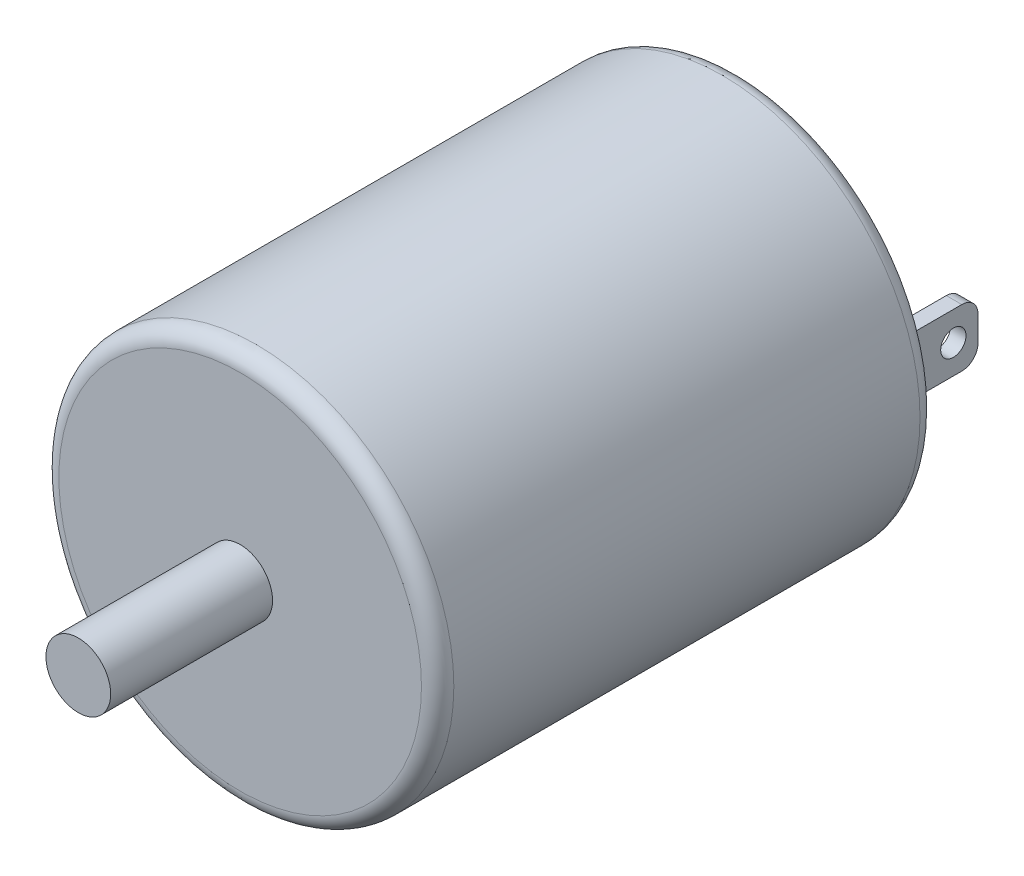
ISO-10303-21;
HEADER;
FILE_DESCRIPTION(('STEP AP214'),'2;1');
FILE_NAME('part.step','',(''),(''),'','','');
FILE_SCHEMA(('AUTOMOTIVE_DESIGN { 1 0 10303 214 1 1 1 1 }'));
ENDSEC;
DATA;
#1=APPLICATION_CONTEXT('core data for automotive mechanical design processes');
#2=APPLICATION_PROTOCOL_DEFINITION('international standard','automotive_design',2000,#1);
#3=PRODUCT_CONTEXT('',#1,'mechanical');
#4=PRODUCT('Part','Part','',(#3));
#5=PRODUCT_RELATED_PRODUCT_CATEGORY('part','',(#4));
#6=PRODUCT_DEFINITION_FORMATION('','',#4);
#7=PRODUCT_DEFINITION_CONTEXT('part definition',#1,'design');
#8=PRODUCT_DEFINITION('design','',#6,#7);
#9=PRODUCT_DEFINITION_SHAPE('','',#8);
#10=(LENGTH_UNIT() NAMED_UNIT(*) SI_UNIT(.MILLI.,.METRE.));
#11=(NAMED_UNIT(*) PLANE_ANGLE_UNIT() SI_UNIT($,.RADIAN.));
#12=(NAMED_UNIT(*) SI_UNIT($,.STERADIAN.) SOLID_ANGLE_UNIT());
#13=UNCERTAINTY_MEASURE_WITH_UNIT(LENGTH_MEASURE(1.E-05),#10,'distance_accuracy_value','');
#14=(GEOMETRIC_REPRESENTATION_CONTEXT(3) GLOBAL_UNCERTAINTY_ASSIGNED_CONTEXT((#13)) GLOBAL_UNIT_ASSIGNED_CONTEXT((#10,
#11,#12)) REPRESENTATION_CONTEXT('',''));
#15=CARTESIAN_POINT('',(0.,0.,0.));
#16=DIRECTION('',(0.,0.,1.));
#17=DIRECTION('',(1.,0.,0.));
#18=AXIS2_PLACEMENT_3D('',#15,#16,#17);
#19=CARTESIAN_POINT('',(0.,0.,0.));
#20=DIRECTION('',(0.,0.,1.));
#21=DIRECTION('',(1.,0.,0.));
#22=AXIS2_PLACEMENT_3D('',#19,#20,#21);
#23=PLANE('',#22);
#24=DIRECTION('',(0.,-1.,0.));
#25=VECTOR('',#24,1.);
#26=CARTESIAN_POINT('',(9.78281553796734,2.33021416497081,0.));
#27=LINE('',#26,#25);
#28=CARTESIAN_POINT('',(9.78281553796734,2.33021416497081,0.));
#29=VERTEX_POINT('',#28);
#30=CARTESIAN_POINT('',(9.78281553796734,-1.23400517051664,0.));
#31=VERTEX_POINT('',#30);
#32=EDGE_CURVE('E163',#29,#31,#27,.T.);
#33=ORIENTED_EDGE('',*,*,#32,.F.);
#34=DIRECTION('',(1.,0.,0.));
#35=VECTOR('',#34,1.);
#36=CARTESIAN_POINT('',(9.78281553796734,2.33021416497081,0.));
#37=LINE('',#36,#35);
#38=CARTESIAN_POINT('',(8.82391201155741,2.33021416497081,0.));
#39=VERTEX_POINT('',#38);
#40=EDGE_CURVE('E168',#39,#29,#37,.T.);
#41=ORIENTED_EDGE('',*,*,#40,.F.);
#42=DIRECTION('',(0.,1.,0.));
#43=VECTOR('',#42,1.);
#44=CARTESIAN_POINT('',(8.82391201155741,2.33021416497081,0.));
#45=LINE('',#44,#43);
#46=CARTESIAN_POINT('',(8.82391201155741,-1.23400517051664,0.));
#47=VERTEX_POINT('',#46);
#48=EDGE_CURVE('E177',#47,#39,#45,.T.);
#49=ORIENTED_EDGE('',*,*,#48,.F.);
#50=DIRECTION('',(-1.,0.,0.));
#51=VECTOR('',#50,1.);
#52=CARTESIAN_POINT('',(9.78281553796734,-1.23400517051664,0.));
#53=LINE('',#52,#51);
#54=EDGE_CURVE('E174',#31,#47,#53,.T.);
#55=ORIENTED_EDGE('',*,*,#54,.F.);
#56=EDGE_LOOP('',(#33,#41,#49,#55));
#57=FACE_BOUND('',#56,.T.);
#58=CARTESIAN_POINT('',(0.,0.,0.));
#59=DIRECTION('',(0.,0.,1.));
#60=DIRECTION('',(1.,0.,0.));
#61=AXIS2_PLACEMENT_3D('',#58,#59,#60);
#62=CIRCLE('',#61,11.2);
#63=CARTESIAN_POINT('',(11.2,0.,0.));
#64=VERTEX_POINT('',#63);
#65=EDGE_CURVE('E201',#64,#64,#62,.F.);
#66=ORIENTED_EDGE('',*,*,#65,.T.);
#67=EDGE_LOOP('',(#66));
#68=FACE_BOUND('',#67,.T.);
#69=DIRECTION('',(0.,1.,0.));
#70=VECTOR('',#69,1.);
#71=CARTESIAN_POINT('',(-8.81697969084172,2.33021416497081,0.));
#72=LINE('',#71,#70);
#73=CARTESIAN_POINT('',(-8.81697969084172,-1.23400517051664,0.));
#74=VERTEX_POINT('',#73);
#75=CARTESIAN_POINT('',(-8.81697969084172,2.33021416497081,0.));
#76=VERTEX_POINT('',#75);
#77=EDGE_CURVE('E129',#74,#76,#72,.T.);
#78=ORIENTED_EDGE('',*,*,#77,.F.);
#79=DIRECTION('',(-1.,0.,0.));
#80=VECTOR('',#79,1.);
#81=CARTESIAN_POINT('',(-8.81697969084172,-1.23400517051664,0.));
#82=LINE('',#81,#80);
#83=CARTESIAN_POINT('',(-7.92257314699185,-1.23400517051664,0.));
#84=VERTEX_POINT('',#83);
#85=EDGE_CURVE('E142',#84,#74,#82,.T.);
#86=ORIENTED_EDGE('',*,*,#85,.F.);
#87=DIRECTION('',(0.,-1.,0.));
#88=VECTOR('',#87,1.);
#89=CARTESIAN_POINT('',(-7.92257314699185,2.33021416497081,0.));
#90=LINE('',#89,#88);
#91=CARTESIAN_POINT('',(-7.92257314699185,2.33021416497081,0.));
#92=VERTEX_POINT('',#91);
#93=EDGE_CURVE('E151',#92,#84,#90,.T.);
#94=ORIENTED_EDGE('',*,*,#93,.F.);
#95=DIRECTION('',(1.,0.,0.));
#96=VECTOR('',#95,1.);
#97=CARTESIAN_POINT('',(-8.81697969084172,2.33021416497081,0.));
#98=LINE('',#97,#96);
#99=EDGE_CURVE('E145',#76,#92,#98,.T.);
#100=ORIENTED_EDGE('',*,*,#99,.F.);
#101=EDGE_LOOP('',(#78,#86,#94,#100));
#102=FACE_BOUND('',#101,.T.);
#103=ADVANCED_FACE('F35',(#57,#68,#102),#23,.F.);
#104=CARTESIAN_POINT('',(0.,0.,30.8));
#105=DIRECTION('',(0.,0.,1.));
#106=DIRECTION('',(1.,0.,0.));
#107=AXIS2_PLACEMENT_3D('',#104,#105,#106);
#108=PLANE('',#107);
#109=CARTESIAN_POINT('',(0.,0.,30.8));
#110=DIRECTION('',(0.,0.,1.));
#111=DIRECTION('',(1.,0.,0.));
#112=AXIS2_PLACEMENT_3D('',#109,#110,#111);
#113=CIRCLE('',#112,11.2);
#114=CARTESIAN_POINT('',(11.2,0.,30.8));
#115=VERTEX_POINT('',#114);
#116=EDGE_CURVE('E204',#115,#115,#113,.T.);
#117=ORIENTED_EDGE('',*,*,#116,.T.);
#118=EDGE_LOOP('',(#117));
#119=FACE_BOUND('',#118,.T.);
#120=CARTESIAN_POINT('',(0.,0.,30.8));
#121=DIRECTION('',(0.,0.,1.));
#122=DIRECTION('',(1.,0.,0.));
#123=AXIS2_PLACEMENT_3D('',#120,#121,#122);
#124=CIRCLE('',#123,2.);
#125=CARTESIAN_POINT('',(2.,0.,30.8));
#126=VERTEX_POINT('',#125);
#127=EDGE_CURVE('E189',#126,#126,#124,.T.);
#128=ORIENTED_EDGE('',*,*,#127,.F.);
#129=EDGE_LOOP('',(#128));
#130=FACE_BOUND('',#129,.T.);
#131=ADVANCED_FACE('F271',(#119,#130),#108,.T.);
#132=CARTESIAN_POINT('',(0.,0.,30.8));
#133=DIRECTION('',(0.,0.,-1.));
#134=DIRECTION('',(-1.,0.,0.));
#135=AXIS2_PLACEMENT_3D('',#132,#133,#134);
#136=CYLINDRICAL_SURFACE('',#135,12.2);
#137=CARTESIAN_POINT('',(0.,0.,1.));
#138=DIRECTION('',(0.,0.,1.));
#139=DIRECTION('',(1.,0.,0.));
#140=AXIS2_PLACEMENT_3D('',#137,#138,#139);
#141=CIRCLE('',#140,12.2);
#142=CARTESIAN_POINT('',(-12.2,0.,0.999999999999997));
#143=VERTEX_POINT('',#142);
#144=EDGE_CURVE('E198',#143,#143,#141,.T.);
#145=CARTESIAN_POINT('',(0.,0.,29.8));
#146=DIRECTION('',(0.,0.,1.));
#147=DIRECTION('',(1.,0.,0.));
#148=AXIS2_PLACEMENT_3D('',#145,#146,#147);
#149=CIRCLE('',#148,12.2);
#150=CARTESIAN_POINT('',(-12.2,0.,29.8));
#151=VERTEX_POINT('',#150);
#152=EDGE_CURVE('E193',#151,#151,#149,.F.);
#153=CARTESIAN_POINT('',(-12.2,0.,0.999999999999997));
#154=CARTESIAN_POINT('',(-12.2,0.,1.3));
#155=CARTESIAN_POINT('',(-12.2,0.,1.6));
#156=CARTESIAN_POINT('',(-12.2,0.,2.2));
#157=CARTESIAN_POINT('',(-12.2,0.,2.5));
#158=CARTESIAN_POINT('',(-12.2,0.,3.1));
#159=CARTESIAN_POINT('',(-12.2,0.,3.4));
#160=CARTESIAN_POINT('',(-12.2,0.,4.));
#161=CARTESIAN_POINT('',(-12.2,0.,4.3));
#162=CARTESIAN_POINT('',(-12.2,0.,4.9));
#163=CARTESIAN_POINT('',(-12.2,0.,5.2));
#164=CARTESIAN_POINT('',(-12.2,0.,5.8));
#165=CARTESIAN_POINT('',(-12.2,0.,6.1));
#166=CARTESIAN_POINT('',(-12.2,0.,6.7));
#167=CARTESIAN_POINT('',(-12.2,0.,7.));
#168=CARTESIAN_POINT('',(-12.2,0.,7.6));
#169=CARTESIAN_POINT('',(-12.2,0.,7.9));
#170=CARTESIAN_POINT('',(-12.2,0.,8.5));
#171=CARTESIAN_POINT('',(-12.2,0.,8.8));
#172=CARTESIAN_POINT('',(-12.2,0.,9.4));
#173=CARTESIAN_POINT('',(-12.2,0.,9.7));
#174=CARTESIAN_POINT('',(-12.2,0.,10.3));
#175=CARTESIAN_POINT('',(-12.2,0.,10.6));
#176=CARTESIAN_POINT('',(-12.2,0.,11.2));
#177=CARTESIAN_POINT('',(-12.2,0.,11.5));
#178=CARTESIAN_POINT('',(-12.2,0.,12.1));
#179=CARTESIAN_POINT('',(-12.2,0.,12.4));
#180=CARTESIAN_POINT('',(-12.2,0.,13.));
#181=CARTESIAN_POINT('',(-12.2,0.,13.3));
#182=CARTESIAN_POINT('',(-12.2,0.,13.9));
#183=CARTESIAN_POINT('',(-12.2,0.,14.2));
#184=CARTESIAN_POINT('',(-12.2,0.,14.8));
#185=CARTESIAN_POINT('',(-12.2,0.,15.1));
#186=CARTESIAN_POINT('',(-12.2,0.,15.7));
#187=CARTESIAN_POINT('',(-12.2,0.,16.));
#188=CARTESIAN_POINT('',(-12.2,0.,16.6));
#189=CARTESIAN_POINT('',(-12.2,0.,16.9));
#190=CARTESIAN_POINT('',(-12.2,0.,17.5));
#191=CARTESIAN_POINT('',(-12.2,0.,17.8));
#192=CARTESIAN_POINT('',(-12.2,0.,18.4));
#193=CARTESIAN_POINT('',(-12.2,0.,18.7));
#194=CARTESIAN_POINT('',(-12.2,0.,19.3));
#195=CARTESIAN_POINT('',(-12.2,0.,19.6));
#196=CARTESIAN_POINT('',(-12.2,0.,20.2));
#197=CARTESIAN_POINT('',(-12.2,0.,20.5));
#198=CARTESIAN_POINT('',(-12.2,0.,21.1));
#199=CARTESIAN_POINT('',(-12.2,0.,21.4));
#200=CARTESIAN_POINT('',(-12.2,0.,22.));
#201=CARTESIAN_POINT('',(-12.2,0.,22.3));
#202=CARTESIAN_POINT('',(-12.2,0.,22.9));
#203=CARTESIAN_POINT('',(-12.2,0.,23.2));
#204=CARTESIAN_POINT('',(-12.2,0.,23.8));
#205=CARTESIAN_POINT('',(-12.2,0.,24.1));
#206=CARTESIAN_POINT('',(-12.2,0.,24.7));
#207=CARTESIAN_POINT('',(-12.2,0.,25.));
#208=CARTESIAN_POINT('',(-12.2,0.,25.6));
#209=CARTESIAN_POINT('',(-12.2,0.,25.9));
#210=CARTESIAN_POINT('',(-12.2,0.,26.5));
#211=CARTESIAN_POINT('',(-12.2,0.,26.8));
#212=CARTESIAN_POINT('',(-12.2,0.,27.4));
#213=CARTESIAN_POINT('',(-12.2,0.,27.7));
#214=CARTESIAN_POINT('',(-12.2,0.,28.3));
#215=CARTESIAN_POINT('',(-12.2,0.,28.6));
#216=CARTESIAN_POINT('',(-12.2,0.,29.2));
#217=CARTESIAN_POINT('',(-12.2,0.,29.5));
#218=CARTESIAN_POINT('',(-12.2,0.,29.8));
#219=B_SPLINE_CURVE_WITH_KNOTS('',3,(#153,#154,#155,#156,#157,#158,#159,#160,#161,#162,#163,
#164,#165,#166,#167,#168,#169,#170,#171,#172,#173,#174,#175,#176,#177,#178,#179,#180,#181,#182,
#183,#184,#185,#186,#187,#188,#189,#190,#191,#192,#193,#194,#195,#196,#197,#198,#199,#200,#201,
#202,#203,#204,#205,#206,#207,#208,#209,#210,#211,#212,#213,#214,#215,#216,#217,#218),
.UNSPECIFIED.,.F.,.F.,(4,2,2,2,2,2,2,2,2,2,2,2,2,2,2,2,2,2,2,2,2,2,2,2,2,2,2,2,2,2,2,2,4),(0.,
0.900000000000001,1.8,2.7,3.6,4.5,5.4,6.3,7.2,8.1,9.,9.9,10.8,11.7,12.6,13.5,14.4,15.3,16.2,
17.1,18.,18.9,19.8,20.7,21.6,22.5,23.4,24.3,25.2,26.1,27.,27.9,28.8),.UNSPECIFIED.);
#220=EDGE_CURVE('BSEAM276',#143,#151,#219,.T.);
#221=ORIENTED_EDGE('',*,*,#144,.T.);
#222=ORIENTED_EDGE('',*,*,#152,.T.);
#223=ORIENTED_EDGE('',*,*,#220,.T.);
#224=ORIENTED_EDGE('',*,*,#220,.F.);
#225=EDGE_LOOP('',(#221,#223,#222,#224));
#226=FACE_BOUND('',#225,.T.);
#227=ADVANCED_FACE('F276',(#226),#136,.T.);
#228=CARTESIAN_POINT('',(0.,0.,1.));
#229=DIRECTION('',(0.,0.,1.));
#230=DIRECTION('',(1.,0.,0.));
#231=AXIS2_PLACEMENT_3D('',#228,#229,#230);
#232=TOROIDAL_SURFACE('',#231,11.2,1.);
#233=ORIENTED_EDGE('',*,*,#65,.F.);
#234=EDGE_LOOP('',(#233));
#235=FACE_BOUND('',#234,.T.);
#236=ORIENTED_EDGE('',*,*,#144,.F.);
#237=EDGE_LOOP('',(#236));
#238=FACE_BOUND('',#237,.T.);
#239=ADVANCED_FACE('F283',(#235,#238),#232,.T.);
#240=CARTESIAN_POINT('',(0.,0.,29.8));
#241=DIRECTION('',(0.,0.,1.));
#242=DIRECTION('',(1.,0.,0.));
#243=AXIS2_PLACEMENT_3D('',#240,#241,#242);
#244=TOROIDAL_SURFACE('',#243,11.2,1.);
#245=ORIENTED_EDGE('',*,*,#152,.F.);
#246=EDGE_LOOP('',(#245));
#247=FACE_BOUND('',#246,.T.);
#248=ORIENTED_EDGE('',*,*,#116,.F.);
#249=EDGE_LOOP('',(#248));
#250=FACE_BOUND('',#249,.T.);
#251=ADVANCED_FACE('F287',(#247,#250),#244,.T.);
#252=CARTESIAN_POINT('',(0.,0.,40.8));
#253=DIRECTION('',(0.,0.,-1.));
#254=DIRECTION('',(-1.,0.,0.));
#255=AXIS2_PLACEMENT_3D('',#252,#253,#254);
#256=CYLINDRICAL_SURFACE('',#255,2.);
#257=CARTESIAN_POINT('',(0.,0.,40.8));
#258=DIRECTION('',(0.,0.,1.));
#259=DIRECTION('',(1.,0.,0.));
#260=AXIS2_PLACEMENT_3D('',#257,#258,#259);
#261=CIRCLE('',#260,2.);
#262=CARTESIAN_POINT('',(2.,0.,40.8));
#263=VERTEX_POINT('',#262);
#264=EDGE_CURVE('E190',#263,#263,#261,.T.);
#265=ORIENTED_EDGE('',*,*,#264,.F.);
#266=EDGE_LOOP('',(#265));
#267=FACE_BOUND('',#266,.T.);
#268=ORIENTED_EDGE('',*,*,#127,.T.);
#269=EDGE_LOOP('',(#268));
#270=FACE_BOUND('',#269,.T.);
#271=ADVANCED_FACE('F291',(#267,#270),#256,.T.);
#272=CARTESIAN_POINT('',(0.,0.,40.8));
#273=DIRECTION('',(0.,0.,1.));
#274=DIRECTION('',(1.,0.,0.));
#275=AXIS2_PLACEMENT_3D('',#272,#273,#274);
#276=PLANE('',#275);
#277=ORIENTED_EDGE('',*,*,#264,.T.);
#278=EDGE_LOOP('',(#277));
#279=FACE_BOUND('',#278,.T.);
#280=ADVANCED_FACE('F340',(#279),#276,.T.);
#281=CARTESIAN_POINT('',(9.78281553796734,2.33021416497081,-5.));
#282=DIRECTION('',(-1.,0.,0.));
#283=DIRECTION('',(0.,0.,1.));
#284=AXIS2_PLACEMENT_3D('',#281,#282,#283);
#285=PLANE('',#284);
#286=CARTESIAN_POINT('',(9.78281553796734,0.548104497227087,-3.47716986038904));
#287=DIRECTION('',(1.,0.,0.));
#288=DIRECTION('',(0.,0.,-1.));
#289=AXIS2_PLACEMENT_3D('',#286,#287,#288);
#290=CIRCLE('',#289,0.782109667743725);
#291=CARTESIAN_POINT('',(9.78281553796734,0.548104497227087,-4.25927952813276));
#292=VERTEX_POINT('',#291);
#293=EDGE_CURVE('E449',#292,#292,#290,.T.);
#294=ORIENTED_EDGE('',*,*,#293,.F.);
#295=EDGE_LOOP('',(#294));
#296=FACE_BOUND('',#295,.T.);
#297=DIRECTION('',(0.,-1.,0.));
#298=VECTOR('',#297,1.);
#299=CARTESIAN_POINT('',(9.78281553796734,2.33021416497081,-5.));
#300=LINE('',#299,#298);
#301=CARTESIAN_POINT('',(9.78281553796734,1.33021416497081,-5.));
#302=VERTEX_POINT('',#301);
#303=CARTESIAN_POINT('',(9.78281553796734,-0.234005170516639,-5.));
#304=VERTEX_POINT('',#303);
#305=EDGE_CURVE('E164',#302,#304,#300,.T.);
#306=ORIENTED_EDGE('',*,*,#305,.F.);
#307=CARTESIAN_POINT('',(9.78281553796734,1.33021416497081,-4.));
#308=DIRECTION('',(-1.,0.,0.));
#309=DIRECTION('',(0.,0.,1.));
#310=AXIS2_PLACEMENT_3D('',#307,#308,#309);
#311=CIRCLE('',#310,1.);
#312=CARTESIAN_POINT('',(9.78281553796734,2.33021416497081,-4.));
#313=VERTEX_POINT('',#312);
#314=EDGE_CURVE('E232',#302,#313,#311,.F.);
#315=ORIENTED_EDGE('',*,*,#314,.T.);
#316=DIRECTION('',(0.,0.,1.));
#317=VECTOR('',#316,1.);
#318=CARTESIAN_POINT('',(9.78281553796734,2.33021416497081,-5.));
#319=LINE('',#318,#317);
#320=EDGE_CURVE('E171',#313,#29,#319,.T.);
#321=ORIENTED_EDGE('',*,*,#320,.T.);
#322=ORIENTED_EDGE('',*,*,#32,.T.);
#323=DIRECTION('',(0.,0.,1.));
#324=VECTOR('',#323,1.);
#325=CARTESIAN_POINT('',(9.78281553796734,-1.23400517051664,-5.));
#326=LINE('',#325,#324);
#327=CARTESIAN_POINT('',(9.78281553796734,-1.23400517051664,-4.));
#328=VERTEX_POINT('',#327);
#329=EDGE_CURVE('E187',#328,#31,#326,.T.);
#330=ORIENTED_EDGE('',*,*,#329,.F.);
#331=CARTESIAN_POINT('',(9.78281553796734,-0.234005170516639,-4.));
#332=DIRECTION('',(-1.,0.,0.));
#333=DIRECTION('',(0.,0.,1.));
#334=AXIS2_PLACEMENT_3D('',#331,#332,#333);
#335=CIRCLE('',#334,1.);
#336=EDGE_CURVE('E230',#328,#304,#335,.F.);
#337=ORIENTED_EDGE('',*,*,#336,.T.);
#338=EDGE_LOOP('',(#306,#315,#321,#322,#330,#337));
#339=FACE_BOUND('',#338,.T.);
#340=ADVANCED_FACE('F246',(#296,#339),#285,.F.);
#341=CARTESIAN_POINT('',(9.78281553796734,-1.23400517051664,-5.));
#342=DIRECTION('',(0.,1.,0.));
#343=DIRECTION('',(0.,0.,1.));
#344=AXIS2_PLACEMENT_3D('',#341,#342,#343);
#345=PLANE('',#344);
#346=DIRECTION('',(0.,0.,1.));
#347=VECTOR('',#346,1.);
#348=CARTESIAN_POINT('',(8.82391201155741,-1.23400517051664,-5.));
#349=LINE('',#348,#347);
#350=CARTESIAN_POINT('',(8.82391201155741,-1.23400517051664,-4.));
#351=VERTEX_POINT('',#350);
#352=EDGE_CURVE('E185',#351,#47,#349,.T.);
#353=ORIENTED_EDGE('',*,*,#352,.F.);
#354=DIRECTION('',(-1.,0.,0.));
#355=VECTOR('',#354,1.);
#356=CARTESIAN_POINT('',(9.78281553796734,-1.23400517051664,-4.));
#357=LINE('',#356,#355);
#358=EDGE_CURVE('E11',#351,#328,#357,.F.);
#359=ORIENTED_EDGE('',*,*,#358,.T.);
#360=ORIENTED_EDGE('',*,*,#329,.T.);
#361=ORIENTED_EDGE('',*,*,#54,.T.);
#362=EDGE_LOOP('',(#353,#359,#360,#361));
#363=FACE_BOUND('',#362,.T.);
#364=ADVANCED_FACE('F256',(#363),#345,.F.);
#365=CARTESIAN_POINT('',(8.82391201155741,2.33021416497081,-5.));
#366=DIRECTION('',(1.,0.,0.));
#367=DIRECTION('',(0.,0.,-1.));
#368=AXIS2_PLACEMENT_3D('',#365,#366,#367);
#369=PLANE('',#368);
#370=CARTESIAN_POINT('',(8.82391201155741,0.548104497227087,-3.47716986038904));
#371=DIRECTION('',(1.,0.,0.));
#372=DIRECTION('',(0.,0.,-1.));
#373=AXIS2_PLACEMENT_3D('',#370,#371,#372);
#374=CIRCLE('',#373,0.782109667743725);
#375=CARTESIAN_POINT('',(8.82391201155741,0.548104497227087,-4.25927952813276));
#376=VERTEX_POINT('',#375);
#377=EDGE_CURVE('E146',#376,#376,#374,.T.);
#378=ORIENTED_EDGE('',*,*,#377,.T.);
#379=EDGE_LOOP('',(#378));
#380=FACE_BOUND('',#379,.T.);
#381=DIRECTION('',(0.,0.,1.));
#382=VECTOR('',#381,1.);
#383=CARTESIAN_POINT('',(8.82391201155741,2.33021416497081,-5.));
#384=LINE('',#383,#382);
#385=CARTESIAN_POINT('',(8.82391201155741,2.33021416497081,-4.));
#386=VERTEX_POINT('',#385);
#387=EDGE_CURVE('E183',#386,#39,#384,.T.);
#388=ORIENTED_EDGE('',*,*,#387,.F.);
#389=CARTESIAN_POINT('',(8.82391201155741,1.33021416497081,-4.));
#390=DIRECTION('',(1.,0.,0.));
#391=DIRECTION('',(0.,0.,-1.));
#392=AXIS2_PLACEMENT_3D('',#389,#390,#391);
#393=CIRCLE('',#392,1.);
#394=CARTESIAN_POINT('',(8.82391201155741,1.33021416497081,-5.));
#395=VERTEX_POINT('',#394);
#396=EDGE_CURVE('E44',#386,#395,#393,.F.);
#397=ORIENTED_EDGE('',*,*,#396,.T.);
#398=DIRECTION('',(0.,1.,0.));
#399=VECTOR('',#398,1.);
#400=CARTESIAN_POINT('',(8.82391201155741,2.33021416497081,-5.));
#401=LINE('',#400,#399);
#402=CARTESIAN_POINT('',(8.82391201155741,-0.234005170516639,-5.));
#403=VERTEX_POINT('',#402);
#404=EDGE_CURVE('E167',#403,#395,#401,.T.);
#405=ORIENTED_EDGE('',*,*,#404,.F.);
#406=CARTESIAN_POINT('',(8.82391201155741,-0.234005170516639,-4.));
#407=DIRECTION('',(1.,0.,0.));
#408=DIRECTION('',(0.,0.,-1.));
#409=AXIS2_PLACEMENT_3D('',#406,#407,#408);
#410=CIRCLE('',#409,1.);
#411=EDGE_CURVE('E51',#403,#351,#410,.F.);
#412=ORIENTED_EDGE('',*,*,#411,.T.);
#413=ORIENTED_EDGE('',*,*,#352,.T.);
#414=ORIENTED_EDGE('',*,*,#48,.T.);
#415=EDGE_LOOP('',(#388,#397,#405,#412,#413,#414));
#416=FACE_BOUND('',#415,.T.);
#417=ADVANCED_FACE('F237',(#380,#416),#369,.F.);
#418=CARTESIAN_POINT('',(9.78281553796734,2.33021416497081,-5.));
#419=DIRECTION('',(0.,-1.,0.));
#420=DIRECTION('',(0.,0.,-1.));
#421=AXIS2_PLACEMENT_3D('',#418,#419,#420);
#422=PLANE('',#421);
#423=ORIENTED_EDGE('',*,*,#320,.F.);
#424=DIRECTION('',(1.,0.,0.));
#425=VECTOR('',#424,1.);
#426=CARTESIAN_POINT('',(8.82391201155741,2.33021416497081,-4.));
#427=LINE('',#426,#425);
#428=EDGE_CURVE('E59',#313,#386,#427,.F.);
#429=ORIENTED_EDGE('',*,*,#428,.T.);
#430=ORIENTED_EDGE('',*,*,#387,.T.);
#431=ORIENTED_EDGE('',*,*,#40,.T.);
#432=EDGE_LOOP('',(#423,#429,#430,#431));
#433=FACE_BOUND('',#432,.T.);
#434=ADVANCED_FACE('F248',(#433),#422,.F.);
#435=CARTESIAN_POINT('',(9.78281553796734,-1.23400517051664,-5.));
#436=DIRECTION('',(0.,0.,-1.));
#437=DIRECTION('',(-1.,0.,0.));
#438=AXIS2_PLACEMENT_3D('',#435,#436,#437);
#439=PLANE('',#438);
#440=ORIENTED_EDGE('',*,*,#404,.T.);
#441=DIRECTION('',(1.,0.,0.));
#442=VECTOR('',#441,1.);
#443=CARTESIAN_POINT('',(9.78281553796734,1.33021416497081,-5.));
#444=LINE('',#443,#442);
#445=EDGE_CURVE('E227',#395,#302,#444,.T.);
#446=ORIENTED_EDGE('',*,*,#445,.T.);
#447=ORIENTED_EDGE('',*,*,#305,.T.);
#448=DIRECTION('',(-1.,0.,0.));
#449=VECTOR('',#448,1.);
#450=CARTESIAN_POINT('',(8.82391201155741,-0.234005170516639,-5.));
#451=LINE('',#450,#449);
#452=EDGE_CURVE('E224',#304,#403,#451,.T.);
#453=ORIENTED_EDGE('',*,*,#452,.T.);
#454=EDGE_LOOP('',(#440,#446,#447,#453));
#455=FACE_BOUND('',#454,.T.);
#456=ADVANCED_FACE('F241',(#455),#439,.T.);
#457=CARTESIAN_POINT('',(-8.81697969084172,2.33021416497081,-5.));
#458=DIRECTION('',(1.,0.,0.));
#459=DIRECTION('',(0.,0.,-1.));
#460=AXIS2_PLACEMENT_3D('',#457,#458,#459);
#461=PLANE('',#460);
#462=CARTESIAN_POINT('',(-8.81697969084172,0.548104497227087,-3.47716986038904));
#463=DIRECTION('',(1.,0.,0.));
#464=DIRECTION('',(0.,0.,-1.));
#465=AXIS2_PLACEMENT_3D('',#462,#463,#464);
#466=CIRCLE('',#465,0.782109667743725);
#467=CARTESIAN_POINT('',(-8.81697969084172,0.548104497227087,-4.25927952813276));
#468=VERTEX_POINT('',#467);
#469=EDGE_CURVE('E452',#468,#468,#466,.T.);
#470=ORIENTED_EDGE('',*,*,#469,.T.);
#471=EDGE_LOOP('',(#470));
#472=FACE_BOUND('',#471,.T.);
#473=DIRECTION('',(0.,0.,1.));
#474=VECTOR('',#473,1.);
#475=CARTESIAN_POINT('',(-8.81697969084172,2.33021416497081,-5.));
#476=LINE('',#475,#474);
#477=CARTESIAN_POINT('',(-8.81697969084172,2.33021416497081,-4.));
#478=VERTEX_POINT('',#477);
#479=EDGE_CURVE('E161',#478,#76,#476,.T.);
#480=ORIENTED_EDGE('',*,*,#479,.F.);
#481=CARTESIAN_POINT('',(-8.81697969084172,1.33021416497081,-4.));
#482=DIRECTION('',(1.,0.,0.));
#483=DIRECTION('',(0.,0.,-1.));
#484=AXIS2_PLACEMENT_3D('',#481,#482,#483);
#485=CIRCLE('',#484,1.);
#486=CARTESIAN_POINT('',(-8.81697969084172,1.33021416497081,-5.));
#487=VERTEX_POINT('',#486);
#488=EDGE_CURVE('E220',#478,#487,#485,.F.);
#489=ORIENTED_EDGE('',*,*,#488,.T.);
#490=DIRECTION('',(0.,1.,0.));
#491=VECTOR('',#490,1.);
#492=CARTESIAN_POINT('',(-8.81697969084172,2.33021416497081,-5.));
#493=LINE('',#492,#491);
#494=CARTESIAN_POINT('',(-8.81697969084172,-0.234005170516639,-5.));
#495=VERTEX_POINT('',#494);
#496=EDGE_CURVE('E150',#495,#487,#493,.T.);
#497=ORIENTED_EDGE('',*,*,#496,.F.);
#498=CARTESIAN_POINT('',(-8.81697969084172,-0.234005170516639,-4.));
#499=DIRECTION('',(1.,0.,0.));
#500=DIRECTION('',(0.,0.,-1.));
#501=AXIS2_PLACEMENT_3D('',#498,#499,#500);
#502=CIRCLE('',#501,1.);
#503=CARTESIAN_POINT('',(-8.81697969084172,-1.23400517051664,-4.));
#504=VERTEX_POINT('',#503);
#505=EDGE_CURVE('E131',#495,#504,#502,.F.);
#506=ORIENTED_EDGE('',*,*,#505,.T.);
#507=DIRECTION('',(0.,0.,1.));
#508=VECTOR('',#507,1.);
#509=CARTESIAN_POINT('',(-8.81697969084172,-1.23400517051664,-5.));
#510=LINE('',#509,#508);
#511=EDGE_CURVE('E125',#504,#74,#510,.T.);
#512=ORIENTED_EDGE('',*,*,#511,.T.);
#513=ORIENTED_EDGE('',*,*,#77,.T.);
#514=EDGE_LOOP('',(#480,#489,#497,#506,#512,#513));
#515=FACE_BOUND('',#514,.T.);
#516=ADVANCED_FACE('F128',(#472,#515),#461,.F.);
#517=CARTESIAN_POINT('',(-8.81697969084172,2.33021416497081,-5.));
#518=DIRECTION('',(0.,-1.,0.));
#519=DIRECTION('',(0.,0.,-1.));
#520=AXIS2_PLACEMENT_3D('',#517,#518,#519);
#521=PLANE('',#520);
#522=DIRECTION('',(0.,0.,1.));
#523=VECTOR('',#522,1.);
#524=CARTESIAN_POINT('',(-7.92257314699185,2.33021416497081,-5.));
#525=LINE('',#524,#523);
#526=CARTESIAN_POINT('',(-7.92257314699185,2.33021416497081,-4.));
#527=VERTEX_POINT('',#526);
#528=EDGE_CURVE('E159',#527,#92,#525,.T.);
#529=ORIENTED_EDGE('',*,*,#528,.F.);
#530=DIRECTION('',(1.,0.,0.));
#531=VECTOR('',#530,1.);
#532=CARTESIAN_POINT('',(-8.81697969084172,2.33021416497081,-4.));
#533=LINE('',#532,#531);
#534=EDGE_CURVE('E217',#527,#478,#533,.F.);
#535=ORIENTED_EDGE('',*,*,#534,.T.);
#536=ORIENTED_EDGE('',*,*,#479,.T.);
#537=ORIENTED_EDGE('',*,*,#99,.T.);
#538=EDGE_LOOP('',(#529,#535,#536,#537));
#539=FACE_BOUND('',#538,.T.);
#540=ADVANCED_FACE('F314',(#539),#521,.F.);
#541=CARTESIAN_POINT('',(-7.92257314699185,2.33021416497081,-5.));
#542=DIRECTION('',(-1.,0.,0.));
#543=DIRECTION('',(0.,0.,1.));
#544=AXIS2_PLACEMENT_3D('',#541,#542,#543);
#545=PLANE('',#544);
#546=CARTESIAN_POINT('',(-7.92257314699185,0.548104497227087,-3.47716986038904));
#547=DIRECTION('',(-1.,0.,0.));
#548=DIRECTION('',(0.,0.,1.));
#549=AXIS2_PLACEMENT_3D('',#546,#547,#548);
#550=CIRCLE('',#549,0.782109667743725);
#551=CARTESIAN_POINT('',(-7.92257314699185,0.548104497227087,-2.69506019264532));
#552=VERTEX_POINT('',#551);
#553=EDGE_CURVE('E39',#552,#552,#550,.T.);
#554=ORIENTED_EDGE('',*,*,#553,.T.);
#555=EDGE_LOOP('',(#554));
#556=FACE_BOUND('',#555,.T.);
#557=DIRECTION('',(0.,-1.,0.));
#558=VECTOR('',#557,1.);
#559=CARTESIAN_POINT('',(-7.92257314699185,2.33021416497081,-5.));
#560=LINE('',#559,#558);
#561=CARTESIAN_POINT('',(-7.92257314699185,1.33021416497081,-5.));
#562=VERTEX_POINT('',#561);
#563=CARTESIAN_POINT('',(-7.92257314699185,-0.234005170516639,-5.));
#564=VERTEX_POINT('',#563);
#565=EDGE_CURVE('E136',#562,#564,#560,.T.);
#566=ORIENTED_EDGE('',*,*,#565,.F.);
#567=CARTESIAN_POINT('',(-7.92257314699185,1.33021416497081,-4.));
#568=DIRECTION('',(-1.,0.,0.));
#569=DIRECTION('',(0.,0.,1.));
#570=AXIS2_PLACEMENT_3D('',#567,#568,#569);
#571=CIRCLE('',#570,1.);
#572=EDGE_CURVE('E215',#562,#527,#571,.F.);
#573=ORIENTED_EDGE('',*,*,#572,.T.);
#574=ORIENTED_EDGE('',*,*,#528,.T.);
#575=ORIENTED_EDGE('',*,*,#93,.T.);
#576=DIRECTION('',(0.,0.,1.));
#577=VECTOR('',#576,1.);
#578=CARTESIAN_POINT('',(-7.92257314699185,-1.23400517051664,-5.));
#579=LINE('',#578,#577);
#580=CARTESIAN_POINT('',(-7.92257314699185,-1.23400517051664,-4.));
#581=VERTEX_POINT('',#580);
#582=EDGE_CURVE('E135',#581,#84,#579,.T.);
#583=ORIENTED_EDGE('',*,*,#582,.F.);
#584=CARTESIAN_POINT('',(-7.92257314699185,-0.234005170516639,-4.));
#585=DIRECTION('',(-1.,0.,0.));
#586=DIRECTION('',(0.,0.,1.));
#587=AXIS2_PLACEMENT_3D('',#584,#585,#586);
#588=CIRCLE('',#587,1.);
#589=EDGE_CURVE('E213',#581,#564,#588,.F.);
#590=ORIENTED_EDGE('',*,*,#589,.T.);
#591=EDGE_LOOP('',(#566,#573,#574,#575,#583,#590));
#592=FACE_BOUND('',#591,.T.);
#593=ADVANCED_FACE('F307',(#556,#592),#545,.F.);
#594=CARTESIAN_POINT('',(-8.81697969084172,-1.23400517051664,-5.));
#595=DIRECTION('',(0.,1.,0.));
#596=DIRECTION('',(0.,0.,1.));
#597=AXIS2_PLACEMENT_3D('',#594,#595,#596);
#598=PLANE('',#597);
#599=ORIENTED_EDGE('',*,*,#511,.F.);
#600=DIRECTION('',(-1.,0.,0.));
#601=VECTOR('',#600,1.);
#602=CARTESIAN_POINT('',(-8.81697969084172,-1.23400517051664,-4.));
#603=LINE('',#602,#601);
#604=EDGE_CURVE('E222',#504,#581,#603,.F.);
#605=ORIENTED_EDGE('',*,*,#604,.T.);
#606=ORIENTED_EDGE('',*,*,#582,.T.);
#607=ORIENTED_EDGE('',*,*,#85,.T.);
#608=EDGE_LOOP('',(#599,#605,#606,#607));
#609=FACE_BOUND('',#608,.T.);
#610=ADVANCED_FACE('F148',(#609),#598,.F.);
#611=CARTESIAN_POINT('',(-8.81697969084172,-1.23400517051664,-5.));
#612=DIRECTION('',(0.,0.,1.));
#613=DIRECTION('',(1.,0.,0.));
#614=AXIS2_PLACEMENT_3D('',#611,#612,#613);
#615=PLANE('',#614);
#616=ORIENTED_EDGE('',*,*,#496,.T.);
#617=DIRECTION('',(1.,0.,0.));
#618=VECTOR('',#617,1.);
#619=CARTESIAN_POINT('',(-8.81697969084172,1.33021416497081,-5.));
#620=LINE('',#619,#618);
#621=EDGE_CURVE('E210',#487,#562,#620,.T.);
#622=ORIENTED_EDGE('',*,*,#621,.T.);
#623=ORIENTED_EDGE('',*,*,#565,.T.);
#624=DIRECTION('',(-1.,0.,0.));
#625=VECTOR('',#624,1.);
#626=CARTESIAN_POINT('',(-8.81697969084172,-0.234005170516639,-5.));
#627=LINE('',#626,#625);
#628=EDGE_CURVE('E207',#564,#495,#627,.T.);
#629=ORIENTED_EDGE('',*,*,#628,.T.);
#630=EDGE_LOOP('',(#616,#622,#623,#629));
#631=FACE_BOUND('',#630,.T.);
#632=ADVANCED_FACE('F296',(#631),#615,.F.);
#633=CARTESIAN_POINT('',(-8.81697969084172,1.33021416497081,-4.));
#634=DIRECTION('',(1.,0.,0.));
#635=DIRECTION('',(0.,0.,-1.));
#636=AXIS2_PLACEMENT_3D('',#633,#634,#635);
#637=CYLINDRICAL_SURFACE('',#636,1.);
#638=ORIENTED_EDGE('',*,*,#488,.F.);
#639=ORIENTED_EDGE('',*,*,#534,.F.);
#640=ORIENTED_EDGE('',*,*,#572,.F.);
#641=ORIENTED_EDGE('',*,*,#621,.F.);
#642=EDGE_LOOP('',(#638,#639,#640,#641));
#643=FACE_BOUND('',#642,.T.);
#644=ADVANCED_FACE('F293',(#643),#637,.T.);
#645=CARTESIAN_POINT('',(-8.81697969084172,-0.234005170516639,-4.));
#646=DIRECTION('',(-1.,0.,0.));
#647=DIRECTION('',(0.,0.,1.));
#648=AXIS2_PLACEMENT_3D('',#645,#646,#647);
#649=CYLINDRICAL_SURFACE('',#648,1.);
#650=ORIENTED_EDGE('',*,*,#589,.F.);
#651=ORIENTED_EDGE('',*,*,#604,.F.);
#652=ORIENTED_EDGE('',*,*,#505,.F.);
#653=ORIENTED_EDGE('',*,*,#628,.F.);
#654=EDGE_LOOP('',(#650,#651,#652,#653));
#655=FACE_BOUND('',#654,.T.);
#656=ADVANCED_FACE('F269',(#655),#649,.T.);
#657=CARTESIAN_POINT('',(9.78281553796734,1.33021416497081,-4.));
#658=DIRECTION('',(-1.,0.,0.));
#659=DIRECTION('',(0.,0.,1.));
#660=AXIS2_PLACEMENT_3D('',#657,#658,#659);
#661=CYLINDRICAL_SURFACE('',#660,1.);
#662=ORIENTED_EDGE('',*,*,#396,.F.);
#663=ORIENTED_EDGE('',*,*,#428,.F.);
#664=ORIENTED_EDGE('',*,*,#314,.F.);
#665=ORIENTED_EDGE('',*,*,#445,.F.);
#666=EDGE_LOOP('',(#662,#663,#664,#665));
#667=FACE_BOUND('',#666,.T.);
#668=ADVANCED_FACE('F244',(#667),#661,.T.);
#669=CARTESIAN_POINT('',(9.78281553796734,-0.234005170516639,-4.));
#670=DIRECTION('',(1.,0.,0.));
#671=DIRECTION('',(0.,0.,-1.));
#672=AXIS2_PLACEMENT_3D('',#669,#670,#671);
#673=CYLINDRICAL_SURFACE('',#672,1.);
#674=ORIENTED_EDGE('',*,*,#336,.F.);
#675=ORIENTED_EDGE('',*,*,#358,.F.);
#676=ORIENTED_EDGE('',*,*,#411,.F.);
#677=ORIENTED_EDGE('',*,*,#452,.F.);
#678=EDGE_LOOP('',(#674,#675,#676,#677));
#679=FACE_BOUND('',#678,.T.);
#680=ADVANCED_FACE('F37',(#679),#673,.T.);
#681=CARTESIAN_POINT('',(-12.2,0.548104497227087,-3.47716986038904));
#682=DIRECTION('',(1.,0.,0.));
#683=DIRECTION('',(0.,0.,-1.));
#684=AXIS2_PLACEMENT_3D('',#681,#682,#683);
#685=CYLINDRICAL_SURFACE('',#684,0.782109667743725);
#686=ORIENTED_EDGE('',*,*,#553,.F.);
#687=EDGE_LOOP('',(#686));
#688=FACE_BOUND('',#687,.T.);
#689=ORIENTED_EDGE('',*,*,#469,.F.);
#690=EDGE_LOOP('',(#689));
#691=FACE_BOUND('',#690,.T.);
#692=ADVANCED_FACE('F261',(#688,#691),#685,.F.);
#693=ORIENTED_EDGE('',*,*,#293,.T.);
#694=EDGE_LOOP('',(#693));
#695=FACE_BOUND('',#694,.T.);
#696=ORIENTED_EDGE('',*,*,#377,.F.);
#697=EDGE_LOOP('',(#696));
#698=FACE_BOUND('',#697,.T.);
#699=ADVANCED_FACE('F266',(#695,#698),#685,.F.);
#700=CLOSED_SHELL('',(#103,#131,#227,#239,#251,#271,#280,#340,#364,#417,#434,#456,#516,#540,
#593,#610,#632,#644,#656,#668,#680,#692,#699));
#701=MANIFOLD_SOLID_BREP('B2',#700);
#702=ADVANCED_BREP_SHAPE_REPRESENTATION('',(#18,#701),#14);
#703=SHAPE_DEFINITION_REPRESENTATION(#9,#702);
ENDSEC;
END-ISO-10303-21;
